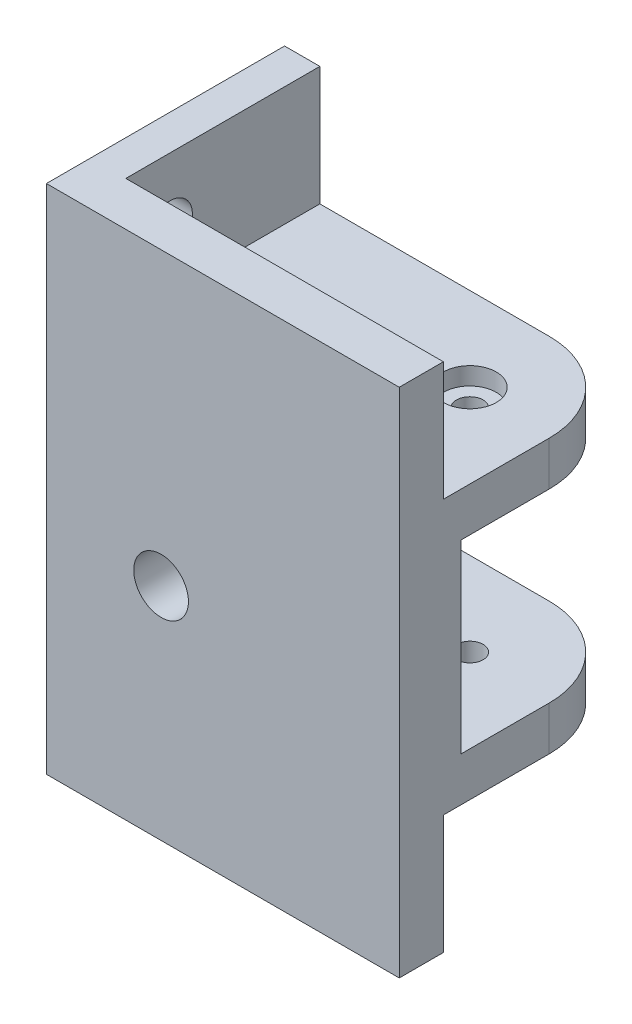
ISO-10303-21;
HEADER;
FILE_DESCRIPTION(('STEP AP214'),'2;1');
FILE_NAME('part.step','',(''),(''),'','','');
FILE_SCHEMA(('AUTOMOTIVE_DESIGN { 1 0 10303 214 1 1 1 1 }'));
ENDSEC;
DATA;
#1=APPLICATION_CONTEXT('core data for automotive mechanical design processes');
#2=APPLICATION_PROTOCOL_DEFINITION('international standard','automotive_design',2000,#1);
#3=PRODUCT_CONTEXT('',#1,'mechanical');
#4=PRODUCT('Part','Part','',(#3));
#5=PRODUCT_RELATED_PRODUCT_CATEGORY('part','',(#4));
#6=PRODUCT_DEFINITION_FORMATION('','',#4);
#7=PRODUCT_DEFINITION_CONTEXT('part definition',#1,'design');
#8=PRODUCT_DEFINITION('design','',#6,#7);
#9=PRODUCT_DEFINITION_SHAPE('','',#8);
#10=(LENGTH_UNIT() NAMED_UNIT(*) SI_UNIT(.MILLI.,.METRE.));
#11=(NAMED_UNIT(*) PLANE_ANGLE_UNIT() SI_UNIT($,.RADIAN.));
#12=(NAMED_UNIT(*) SI_UNIT($,.STERADIAN.) SOLID_ANGLE_UNIT());
#13=UNCERTAINTY_MEASURE_WITH_UNIT(LENGTH_MEASURE(1.E-05),#10,'distance_accuracy_value','');
#14=(GEOMETRIC_REPRESENTATION_CONTEXT(3) GLOBAL_UNCERTAINTY_ASSIGNED_CONTEXT((#13)) GLOBAL_UNIT_ASSIGNED_CONTEXT((#10,
#11,#12)) REPRESENTATION_CONTEXT('',''));
#15=CARTESIAN_POINT('',(0.,0.,0.));
#16=DIRECTION('',(0.,0.,1.));
#17=DIRECTION('',(1.,0.,0.));
#18=AXIS2_PLACEMENT_3D('',#15,#16,#17);
#19=CARTESIAN_POINT('',(10.5,-55.5,-4.));
#20=DIRECTION('',(0.,1.,0.));
#21=DIRECTION('',(0.,0.,1.));
#22=AXIS2_PLACEMENT_3D('',#19,#20,#21);
#23=CYLINDRICAL_SURFACE('',#22,1.51);
#24=CARTESIAN_POINT('',(10.5,18.5,-4.));
#25=DIRECTION('',(0.,1.,0.));
#26=DIRECTION('',(0.,0.,1.));
#27=AXIS2_PLACEMENT_3D('',#24,#25,#26);
#28=CIRCLE('',#27,1.51);
#29=CARTESIAN_POINT('',(10.5,18.5,-2.49));
#30=VERTEX_POINT('',#29);
#31=EDGE_CURVE('E333',#30,#30,#28,.T.);
#32=ORIENTED_EDGE('',*,*,#31,.T.);
#33=EDGE_LOOP('',(#32));
#34=FACE_BOUND('',#33,.T.);
#35=CARTESIAN_POINT('',(10.5,15.5,-4.));
#36=DIRECTION('',(0.,-1.,0.));
#37=DIRECTION('',(0.,0.,-1.));
#38=AXIS2_PLACEMENT_3D('',#35,#36,#37);
#39=CIRCLE('',#38,1.51);
#40=CARTESIAN_POINT('',(10.5,15.5,-5.51));
#41=VERTEX_POINT('',#40);
#42=EDGE_CURVE('E122',#41,#41,#39,.F.);
#43=ORIENTED_EDGE('',*,*,#42,.F.);
#44=EDGE_LOOP('',(#43));
#45=FACE_BOUND('',#44,.T.);
#46=ADVANCED_FACE('F118',(#34,#45),#23,.F.);
#47=CARTESIAN_POINT('',(10.5,39.5,-4.));
#48=DIRECTION('',(0.,1.,0.));
#49=DIRECTION('',(0.,0.,1.));
#50=AXIS2_PLACEMENT_3D('',#47,#48,#49);
#51=CIRCLE('',#50,1.51);
#52=CARTESIAN_POINT('',(10.5,39.5,-2.49));
#53=VERTEX_POINT('',#52);
#54=EDGE_CURVE('E245',#53,#53,#51,.T.);
#55=ORIENTED_EDGE('',*,*,#54,.F.);
#56=EDGE_LOOP('',(#55));
#57=FACE_BOUND('',#56,.T.);
#58=CARTESIAN_POINT('',(10.5,42.5,-4.));
#59=DIRECTION('',(0.,1.,0.));
#60=DIRECTION('',(0.,0.,1.));
#61=AXIS2_PLACEMENT_3D('',#58,#59,#60);
#62=CIRCLE('',#61,1.51);
#63=CARTESIAN_POINT('',(10.5,42.5,-2.49));
#64=VERTEX_POINT('',#63);
#65=EDGE_CURVE('E331',#64,#64,#62,.F.);
#66=ORIENTED_EDGE('',*,*,#65,.F.);
#67=EDGE_LOOP('',(#66));
#68=FACE_BOUND('',#67,.T.);
#69=ADVANCED_FACE('F468',(#57,#68),#23,.F.);
#70=CARTESIAN_POINT('',(0.,0.,8.5));
#71=DIRECTION('',(0.,0.,-1.));
#72=DIRECTION('',(-1.,0.,0.));
#73=AXIS2_PLACEMENT_3D('',#70,#71,#72);
#74=PLANE('',#73);
#75=DIRECTION('',(0.,1.,0.));
#76=VECTOR('',#75,1.);
#77=CARTESIAN_POINT('',(20.,0.,8.5));
#78=LINE('',#77,#76);
#79=CARTESIAN_POINT('',(20.,44.5,8.5));
#80=VERTEX_POINT('',#79);
#81=CARTESIAN_POINT('',(20.,58.,8.5));
#82=VERTEX_POINT('',#81);
#83=EDGE_CURVE('E298',#80,#82,#78,.T.);
#84=ORIENTED_EDGE('',*,*,#83,.F.);
#85=DIRECTION('',(-1.,0.,0.));
#86=VECTOR('',#85,1.);
#87=CARTESIAN_POINT('',(20.,44.5,8.5));
#88=LINE('',#87,#86);
#89=CARTESIAN_POINT('',(-16.,44.5,8.5));
#90=VERTEX_POINT('',#89);
#91=EDGE_CURVE('E390',#80,#90,#88,.T.);
#92=ORIENTED_EDGE('',*,*,#91,.T.);
#93=DIRECTION('',(0.,-1.,0.));
#94=VECTOR('',#93,1.);
#95=CARTESIAN_POINT('',(-16.,58.,8.5));
#96=LINE('',#95,#94);
#97=CARTESIAN_POINT('',(-16.,58.,8.5));
#98=VERTEX_POINT('',#97);
#99=EDGE_CURVE('E282',#98,#90,#96,.T.);
#100=ORIENTED_EDGE('',*,*,#99,.F.);
#101=DIRECTION('',(1.,0.,0.));
#102=VECTOR('',#101,1.);
#103=CARTESIAN_POINT('',(0.,58.,8.5));
#104=LINE('',#103,#102);
#105=EDGE_CURVE('E302',#98,#82,#104,.T.);
#106=ORIENTED_EDGE('',*,*,#105,.T.);
#107=EDGE_LOOP('',(#84,#92,#100,#106));
#108=FACE_BOUND('',#107,.T.);
#109=ADVANCED_FACE('F420',(#108),#74,.T.);
#110=CARTESIAN_POINT('',(-16.,58.,-13.5));
#111=DIRECTION('',(-1.,0.,0.));
#112=DIRECTION('',(0.,0.,1.));
#113=AXIS2_PLACEMENT_3D('',#110,#111,#112);
#114=PLANE('',#113);
#115=CARTESIAN_POINT('',(-16.,50.75,3.5));
#116=DIRECTION('',(-1.,0.,0.));
#117=DIRECTION('',(0.,0.,1.));
#118=AXIS2_PLACEMENT_3D('',#115,#116,#117);
#119=CIRCLE('',#118,2.55);
#120=CARTESIAN_POINT('',(-16.,50.75,6.05));
#121=VERTEX_POINT('',#120);
#122=EDGE_CURVE('E275',#121,#121,#119,.T.);
#123=ORIENTED_EDGE('',*,*,#122,.T.);
#124=EDGE_LOOP('',(#123));
#125=FACE_BOUND('',#124,.T.);
#126=DIRECTION('',(0.,0.,-1.));
#127=VECTOR('',#126,1.);
#128=CARTESIAN_POINT('',(-16.,44.5,8.5));
#129=LINE('',#128,#127);
#130=CARTESIAN_POINT('',(-16.,44.5,-13.5));
#131=VERTEX_POINT('',#130);
#132=EDGE_CURVE('E393',#90,#131,#129,.T.);
#133=ORIENTED_EDGE('',*,*,#132,.T.);
#134=DIRECTION('',(0.,-1.,0.));
#135=VECTOR('',#134,1.);
#136=CARTESIAN_POINT('',(-16.,58.,-13.5));
#137=LINE('',#136,#135);
#138=CARTESIAN_POINT('',(-16.,58.,-13.5));
#139=VERTEX_POINT('',#138);
#140=EDGE_CURVE('E286',#139,#131,#137,.T.);
#141=ORIENTED_EDGE('',*,*,#140,.F.);
#142=DIRECTION('',(0.,0.,1.));
#143=VECTOR('',#142,1.);
#144=CARTESIAN_POINT('',(-16.,58.,-13.5));
#145=LINE('',#144,#143);
#146=EDGE_CURVE('E278',#139,#98,#145,.T.);
#147=ORIENTED_EDGE('',*,*,#146,.T.);
#148=ORIENTED_EDGE('',*,*,#99,.T.);
#149=EDGE_LOOP('',(#133,#141,#147,#148));
#150=FACE_BOUND('',#149,.T.);
#151=ADVANCED_FACE('F415',(#125,#150),#114,.F.);
#152=CARTESIAN_POINT('',(-20.,58.,-13.5));
#153=DIRECTION('',(0.,0.,-1.));
#154=DIRECTION('',(-1.,0.,0.));
#155=AXIS2_PLACEMENT_3D('',#152,#153,#154);
#156=PLANE('',#155);
#157=CARTESIAN_POINT('',(-7.,25.,-13.5));
#158=DIRECTION('',(0.,0.,1.));
#159=DIRECTION('',(1.,0.,0.));
#160=AXIS2_PLACEMENT_3D('',#157,#158,#159);
#161=CIRCLE('',#160,3.1);
#162=CARTESIAN_POINT('',(-3.9,25.,-13.5));
#163=VERTEX_POINT('',#162);
#164=EDGE_CURVE('E359',#163,#163,#161,.T.);
#165=ORIENTED_EDGE('',*,*,#164,.T.);
#166=EDGE_LOOP('',(#165));
#167=FACE_BOUND('',#166,.T.);
#168=DIRECTION('',(0.,-1.,0.));
#169=VECTOR('',#168,1.);
#170=CARTESIAN_POINT('',(10.,18.5,-13.5));
#171=LINE('',#170,#169);
#172=CARTESIAN_POINT('',(10.,18.5,-13.5));
#173=VERTEX_POINT('',#172);
#174=CARTESIAN_POINT('',(10.,13.5,-13.5));
#175=VERTEX_POINT('',#174);
#176=EDGE_CURVE('E378',#173,#175,#171,.T.);
#177=ORIENTED_EDGE('',*,*,#176,.T.);
#178=DIRECTION('',(1.,0.,0.));
#179=VECTOR('',#178,1.);
#180=CARTESIAN_POINT('',(-16.,13.5,-13.5));
#181=LINE('',#180,#179);
#182=CARTESIAN_POINT('',(-16.,13.5,-13.5));
#183=VERTEX_POINT('',#182);
#184=EDGE_CURVE('E362',#183,#175,#181,.T.);
#185=ORIENTED_EDGE('',*,*,#184,.F.);
#186=DIRECTION('',(0.,1.,0.));
#187=VECTOR('',#186,1.);
#188=CARTESIAN_POINT('',(-16.,0.,-13.5));
#189=LINE('',#188,#187);
#190=CARTESIAN_POINT('',(-16.,0.,-13.5));
#191=VERTEX_POINT('',#190);
#192=EDGE_CURVE('E143',#191,#183,#189,.T.);
#193=ORIENTED_EDGE('',*,*,#192,.F.);
#194=DIRECTION('',(1.,0.,0.));
#195=VECTOR('',#194,1.);
#196=CARTESIAN_POINT('',(0.,0.,-13.5));
#197=LINE('',#196,#195);
#198=CARTESIAN_POINT('',(-20.,0.,-13.5));
#199=VERTEX_POINT('',#198);
#200=EDGE_CURVE('E291',#199,#191,#197,.T.);
#201=ORIENTED_EDGE('',*,*,#200,.F.);
#202=DIRECTION('',(0.,-1.,0.));
#203=VECTOR('',#202,1.);
#204=CARTESIAN_POINT('',(-20.,58.,-13.5));
#205=LINE('',#204,#203);
#206=CARTESIAN_POINT('',(-20.,58.,-13.5));
#207=VERTEX_POINT('',#206);
#208=EDGE_CURVE('E12',#207,#199,#205,.T.);
#209=ORIENTED_EDGE('',*,*,#208,.F.);
#210=DIRECTION('',(1.,0.,0.));
#211=VECTOR('',#210,1.);
#212=CARTESIAN_POINT('',(-20.,58.,-13.5));
#213=LINE('',#212,#211);
#214=EDGE_CURVE('E280',#207,#139,#213,.T.);
#215=ORIENTED_EDGE('',*,*,#214,.T.);
#216=ORIENTED_EDGE('',*,*,#140,.T.);
#217=DIRECTION('',(1.,0.,0.));
#218=VECTOR('',#217,1.);
#219=CARTESIAN_POINT('',(-16.,44.5,-13.5));
#220=LINE('',#219,#218);
#221=CARTESIAN_POINT('',(10.,44.5,-13.5));
#222=VERTEX_POINT('',#221);
#223=EDGE_CURVE('E381',#131,#222,#220,.T.);
#224=ORIENTED_EDGE('',*,*,#223,.T.);
#225=DIRECTION('',(0.,1.,0.));
#226=VECTOR('',#225,1.);
#227=CARTESIAN_POINT('',(10.,39.5,-13.5));
#228=LINE('',#227,#226);
#229=CARTESIAN_POINT('',(10.,39.5,-13.5));
#230=VERTEX_POINT('',#229);
#231=EDGE_CURVE('E399',#230,#222,#228,.T.);
#232=ORIENTED_EDGE('',*,*,#231,.F.);
#233=DIRECTION('',(1.,0.,0.));
#234=VECTOR('',#233,1.);
#235=CARTESIAN_POINT('',(-3.84067777581261E-13,39.5,-13.4999999999999));
#236=LINE('',#235,#234);
#237=CARTESIAN_POINT('',(0.,39.5,-13.5));
#238=VERTEX_POINT('',#237);
#239=EDGE_CURVE('E260',#238,#230,#236,.T.);
#240=ORIENTED_EDGE('',*,*,#239,.F.);
#241=DIRECTION('',(0.,1.,0.));
#242=VECTOR('',#241,1.);
#243=CARTESIAN_POINT('',(0.,13.5,-13.5));
#244=LINE('',#243,#242);
#245=CARTESIAN_POINT('',(0.,18.5,-13.5));
#246=VERTEX_POINT('',#245);
#247=EDGE_CURVE('E253',#246,#238,#244,.T.);
#248=ORIENTED_EDGE('',*,*,#247,.F.);
#249=DIRECTION('',(1.,0.,0.));
#250=VECTOR('',#249,1.);
#251=CARTESIAN_POINT('',(0.,18.5,-13.5));
#252=LINE('',#251,#250);
#253=EDGE_CURVE('E261',#246,#173,#252,.T.);
#254=ORIENTED_EDGE('',*,*,#253,.T.);
#255=EDGE_LOOP('',(#177,#185,#193,#201,#209,#215,#216,#224,#232,#240,#248,#254));
#256=FACE_BOUND('',#255,.T.);
#257=ADVANCED_FACE('F120',(#167,#256),#156,.T.);
#258=CARTESIAN_POINT('',(20.,58.,1.5));
#259=DIRECTION('',(1.,0.,0.));
#260=DIRECTION('',(0.,0.,-1.));
#261=AXIS2_PLACEMENT_3D('',#258,#259,#260);
#262=PLANE('',#261);
#263=DIRECTION('',(0.,0.,1.));
#264=VECTOR('',#263,1.);
#265=CARTESIAN_POINT('',(20.,13.5,-3.5));
#266=LINE('',#265,#264);
#267=CARTESIAN_POINT('',(20.,13.5,-3.5));
#268=VERTEX_POINT('',#267);
#269=CARTESIAN_POINT('',(20.,13.5,8.5));
#270=VERTEX_POINT('',#269);
#271=EDGE_CURVE('E370',#268,#270,#266,.T.);
#272=ORIENTED_EDGE('',*,*,#271,.F.);
#273=DIRECTION('',(0.,-1.,0.));
#274=VECTOR('',#273,1.);
#275=CARTESIAN_POINT('',(20.,18.5,-3.5));
#276=LINE('',#275,#274);
#277=CARTESIAN_POINT('',(20.,18.5,-3.5));
#278=VERTEX_POINT('',#277);
#279=EDGE_CURVE('E258',#278,#268,#276,.T.);
#280=ORIENTED_EDGE('',*,*,#279,.F.);
#281=DIRECTION('',(0.,0.,-1.));
#282=VECTOR('',#281,1.);
#283=CARTESIAN_POINT('',(20.,18.5,6.5));
#284=LINE('',#283,#282);
#285=CARTESIAN_POINT('',(20.,18.5,6.5));
#286=VERTEX_POINT('',#285);
#287=EDGE_CURVE('E239',#286,#278,#284,.T.);
#288=ORIENTED_EDGE('',*,*,#287,.F.);
#289=DIRECTION('',(0.,1.,0.));
#290=VECTOR('',#289,1.);
#291=CARTESIAN_POINT('',(20.,13.5,6.5));
#292=LINE('',#291,#290);
#293=CARTESIAN_POINT('',(20.,39.5,6.5));
#294=VERTEX_POINT('',#293);
#295=EDGE_CURVE('E248',#286,#294,#292,.T.);
#296=ORIENTED_EDGE('',*,*,#295,.T.);
#297=DIRECTION('',(0.,0.,1.));
#298=VECTOR('',#297,1.);
#299=CARTESIAN_POINT('',(20.,39.5,0.));
#300=LINE('',#299,#298);
#301=CARTESIAN_POINT('',(20.,39.5,-3.5));
#302=VERTEX_POINT('',#301);
#303=EDGE_CURVE('E254',#302,#294,#300,.T.);
#304=ORIENTED_EDGE('',*,*,#303,.F.);
#305=DIRECTION('',(0.,1.,0.));
#306=VECTOR('',#305,1.);
#307=CARTESIAN_POINT('',(20.,39.5,-3.5));
#308=LINE('',#307,#306);
#309=CARTESIAN_POINT('',(20.,44.5,-3.5));
#310=VERTEX_POINT('',#309);
#311=EDGE_CURVE('E264',#302,#310,#308,.T.);
#312=ORIENTED_EDGE('',*,*,#311,.T.);
#313=DIRECTION('',(0.,0.,1.));
#314=VECTOR('',#313,1.);
#315=CARTESIAN_POINT('',(20.,44.5,-3.5));
#316=LINE('',#315,#314);
#317=EDGE_CURVE('E387',#310,#80,#316,.T.);
#318=ORIENTED_EDGE('',*,*,#317,.T.);
#319=ORIENTED_EDGE('',*,*,#83,.T.);
#320=DIRECTION('',(0.,0.,1.));
#321=VECTOR('',#320,1.);
#322=CARTESIAN_POINT('',(20.,58.,1.5));
#323=LINE('',#322,#321);
#324=CARTESIAN_POINT('',(20.,58.,13.5));
#325=VERTEX_POINT('',#324);
#326=EDGE_CURVE('E316',#82,#325,#323,.T.);
#327=ORIENTED_EDGE('',*,*,#326,.T.);
#328=DIRECTION('',(0.,-1.,0.));
#329=VECTOR('',#328,1.);
#330=CARTESIAN_POINT('',(20.,58.,13.5));
#331=LINE('',#330,#329);
#332=CARTESIAN_POINT('',(20.,0.,13.5));
#333=VERTEX_POINT('',#332);
#334=EDGE_CURVE('E318',#325,#333,#331,.T.);
#335=ORIENTED_EDGE('',*,*,#334,.T.);
#336=DIRECTION('',(0.,0.,1.));
#337=VECTOR('',#336,1.);
#338=CARTESIAN_POINT('',(20.,0.,1.5));
#339=LINE('',#338,#337);
#340=CARTESIAN_POINT('',(20.,0.,8.5));
#341=VERTEX_POINT('',#340);
#342=EDGE_CURVE('E313',#341,#333,#339,.T.);
#343=ORIENTED_EDGE('',*,*,#342,.F.);
#344=DIRECTION('',(0.,-1.,0.));
#345=VECTOR('',#344,1.);
#346=CARTESIAN_POINT('',(20.,0.,8.5));
#347=LINE('',#346,#345);
#348=EDGE_CURVE('E299',#270,#341,#347,.T.);
#349=ORIENTED_EDGE('',*,*,#348,.F.);
#350=EDGE_LOOP('',(#272,#280,#288,#296,#304,#312,#318,#319,#327,#335,#343,#349));
#351=FACE_BOUND('',#350,.T.);
#352=ADVANCED_FACE('F257',(#351),#262,.T.);
#353=CARTESIAN_POINT('',(-20.,58.,13.5));
#354=DIRECTION('',(-1.,0.,0.));
#355=DIRECTION('',(0.,0.,1.));
#356=AXIS2_PLACEMENT_3D('',#353,#354,#355);
#357=PLANE('',#356);
#358=CARTESIAN_POINT('',(-20.,50.75,3.5));
#359=DIRECTION('',(-1.,0.,0.));
#360=DIRECTION('',(0.,0.,1.));
#361=AXIS2_PLACEMENT_3D('',#358,#359,#360);
#362=CIRCLE('',#361,2.55);
#363=CARTESIAN_POINT('',(-20.,50.75,6.05));
#364=VERTEX_POINT('',#363);
#365=EDGE_CURVE('E272',#364,#364,#362,.T.);
#366=ORIENTED_EDGE('',*,*,#365,.F.);
#367=EDGE_LOOP('',(#366));
#368=FACE_BOUND('',#367,.T.);
#369=CARTESIAN_POINT('',(-20.,7.25000000000003,3.5));
#370=DIRECTION('',(-1.,0.,0.));
#371=DIRECTION('',(0.,0.,1.));
#372=AXIS2_PLACEMENT_3D('',#369,#370,#371);
#373=CIRCLE('',#372,2.55);
#374=CARTESIAN_POINT('',(-20.,7.25000000000003,6.05));
#375=VERTEX_POINT('',#374);
#376=EDGE_CURVE('E270',#375,#375,#373,.T.);
#377=ORIENTED_EDGE('',*,*,#376,.F.);
#378=EDGE_LOOP('',(#377));
#379=FACE_BOUND('',#378,.T.);
#380=DIRECTION('',(0.,0.,-1.));
#381=VECTOR('',#380,1.);
#382=CARTESIAN_POINT('',(-20.,58.,13.5));
#383=LINE('',#382,#381);
#384=CARTESIAN_POINT('',(-20.,58.,13.5));
#385=VERTEX_POINT('',#384);
#386=EDGE_CURVE('E309',#385,#207,#383,.T.);
#387=ORIENTED_EDGE('',*,*,#386,.T.);
#388=ORIENTED_EDGE('',*,*,#208,.T.);
#389=DIRECTION('',(0.,0.,-1.));
#390=VECTOR('',#389,1.);
#391=CARTESIAN_POINT('',(-20.,0.,13.5));
#392=LINE('',#391,#390);
#393=CARTESIAN_POINT('',(-20.,0.,13.5));
#394=VERTEX_POINT('',#393);
#395=EDGE_CURVE('E305',#394,#199,#392,.T.);
#396=ORIENTED_EDGE('',*,*,#395,.F.);
#397=DIRECTION('',(0.,-1.,0.));
#398=VECTOR('',#397,1.);
#399=CARTESIAN_POINT('',(-20.,58.,13.5));
#400=LINE('',#399,#398);
#401=EDGE_CURVE('E127',#385,#394,#400,.T.);
#402=ORIENTED_EDGE('',*,*,#401,.F.);
#403=EDGE_LOOP('',(#387,#388,#396,#402));
#404=FACE_BOUND('',#403,.T.);
#405=ADVANCED_FACE('F437',(#368,#379,#404),#357,.T.);
#406=CARTESIAN_POINT('',(5.,58.,1.5));
#407=DIRECTION('',(0.,1.,0.));
#408=DIRECTION('',(0.,0.,1.));
#409=AXIS2_PLACEMENT_3D('',#406,#407,#408);
#410=PLANE('',#409);
#411=ORIENTED_EDGE('',*,*,#326,.F.);
#412=ORIENTED_EDGE('',*,*,#105,.F.);
#413=ORIENTED_EDGE('',*,*,#146,.F.);
#414=ORIENTED_EDGE('',*,*,#214,.F.);
#415=ORIENTED_EDGE('',*,*,#386,.F.);
#416=DIRECTION('',(1.,0.,0.));
#417=VECTOR('',#416,1.);
#418=CARTESIAN_POINT('',(-20.,58.,13.5));
#419=LINE('',#418,#417);
#420=EDGE_CURVE('E312',#385,#325,#419,.T.);
#421=ORIENTED_EDGE('',*,*,#420,.T.);
#422=EDGE_LOOP('',(#411,#412,#413,#414,#415,#421));
#423=FACE_BOUND('',#422,.T.);
#424=ADVANCED_FACE('F423',(#423),#410,.T.);
#425=CARTESIAN_POINT('',(5.,0.,1.5));
#426=DIRECTION('',(0.,1.,0.));
#427=DIRECTION('',(0.,0.,1.));
#428=AXIS2_PLACEMENT_3D('',#425,#426,#427);
#429=PLANE('',#428);
#430=ORIENTED_EDGE('',*,*,#395,.T.);
#431=ORIENTED_EDGE('',*,*,#200,.T.);
#432=DIRECTION('',(0.,0.,1.));
#433=VECTOR('',#432,1.);
#434=CARTESIAN_POINT('',(-16.,0.,-13.5));
#435=LINE('',#434,#433);
#436=CARTESIAN_POINT('',(-16.,0.,8.5));
#437=VERTEX_POINT('',#436);
#438=EDGE_CURVE('E294',#191,#437,#435,.T.);
#439=ORIENTED_EDGE('',*,*,#438,.T.);
#440=DIRECTION('',(1.,0.,0.));
#441=VECTOR('',#440,1.);
#442=CARTESIAN_POINT('',(0.,0.,8.5));
#443=LINE('',#442,#441);
#444=EDGE_CURVE('E301',#437,#341,#443,.T.);
#445=ORIENTED_EDGE('',*,*,#444,.T.);
#446=ORIENTED_EDGE('',*,*,#342,.T.);
#447=DIRECTION('',(1.,0.,0.));
#448=VECTOR('',#447,1.);
#449=CARTESIAN_POINT('',(-20.,0.,13.5));
#450=LINE('',#449,#448);
#451=EDGE_CURVE('E321',#394,#333,#450,.T.);
#452=ORIENTED_EDGE('',*,*,#451,.F.);
#453=EDGE_LOOP('',(#430,#431,#439,#445,#446,#452));
#454=FACE_BOUND('',#453,.T.);
#455=ADVANCED_FACE('F434',(#454),#429,.F.);
#456=CARTESIAN_POINT('',(-20.,58.,13.5));
#457=DIRECTION('',(0.,0.,-1.));
#458=DIRECTION('',(-1.,0.,0.));
#459=AXIS2_PLACEMENT_3D('',#456,#457,#458);
#460=PLANE('',#459);
#461=CARTESIAN_POINT('',(-7.,25.,13.5));
#462=DIRECTION('',(0.,0.,1.));
#463=DIRECTION('',(1.,0.,0.));
#464=AXIS2_PLACEMENT_3D('',#461,#462,#463);
#465=CIRCLE('',#464,3.1);
#466=CARTESIAN_POINT('',(-3.9,25.,13.5));
#467=VERTEX_POINT('',#466);
#468=EDGE_CURVE('E358',#467,#467,#465,.T.);
#469=ORIENTED_EDGE('',*,*,#468,.F.);
#470=EDGE_LOOP('',(#469));
#471=FACE_BOUND('',#470,.T.);
#472=ORIENTED_EDGE('',*,*,#451,.T.);
#473=ORIENTED_EDGE('',*,*,#334,.F.);
#474=ORIENTED_EDGE('',*,*,#420,.F.);
#475=ORIENTED_EDGE('',*,*,#401,.T.);
#476=EDGE_LOOP('',(#472,#473,#474,#475));
#477=FACE_BOUND('',#476,.T.);
#478=ADVANCED_FACE('F431',(#471,#477),#460,.F.);
#479=CARTESIAN_POINT('',(0.,0.,8.5));
#480=DIRECTION('',(0.,0.,-1.));
#481=DIRECTION('',(-1.,0.,0.));
#482=AXIS2_PLACEMENT_3D('',#479,#480,#481);
#483=PLANE('',#482);
#484=DIRECTION('',(-1.,0.,0.));
#485=VECTOR('',#484,1.);
#486=CARTESIAN_POINT('',(20.,13.5,8.5));
#487=LINE('',#486,#485);
#488=CARTESIAN_POINT('',(-16.,13.5,8.5));
#489=VERTEX_POINT('',#488);
#490=EDGE_CURVE('E135',#270,#489,#487,.T.);
#491=ORIENTED_EDGE('',*,*,#490,.F.);
#492=ORIENTED_EDGE('',*,*,#348,.T.);
#493=ORIENTED_EDGE('',*,*,#444,.F.);
#494=DIRECTION('',(0.,1.,0.));
#495=VECTOR('',#494,1.);
#496=CARTESIAN_POINT('',(-16.,0.,8.5));
#497=LINE('',#496,#495);
#498=EDGE_CURVE('E285',#437,#489,#497,.T.);
#499=ORIENTED_EDGE('',*,*,#498,.T.);
#500=EDGE_LOOP('',(#491,#492,#493,#499));
#501=FACE_BOUND('',#500,.T.);
#502=ADVANCED_FACE('F442',(#501),#483,.T.);
#503=CARTESIAN_POINT('',(-16.,0.,-13.5));
#504=DIRECTION('',(1.,0.,0.));
#505=DIRECTION('',(0.,0.,-1.));
#506=AXIS2_PLACEMENT_3D('',#503,#504,#505);
#507=PLANE('',#506);
#508=DIRECTION('',(0.,0.,-1.));
#509=VECTOR('',#508,1.);
#510=CARTESIAN_POINT('',(-16.,13.5,8.5));
#511=LINE('',#510,#509);
#512=EDGE_CURVE('E374',#489,#183,#511,.T.);
#513=ORIENTED_EDGE('',*,*,#512,.F.);
#514=ORIENTED_EDGE('',*,*,#498,.F.);
#515=ORIENTED_EDGE('',*,*,#438,.F.);
#516=ORIENTED_EDGE('',*,*,#192,.T.);
#517=EDGE_LOOP('',(#513,#514,#515,#516));
#518=FACE_BOUND('',#517,.T.);
#519=CARTESIAN_POINT('',(-16.,7.25000000000003,3.5));
#520=DIRECTION('',(1.,0.,0.));
#521=DIRECTION('',(0.,0.,-1.));
#522=AXIS2_PLACEMENT_3D('',#519,#520,#521);
#523=CIRCLE('',#522,2.55);
#524=CARTESIAN_POINT('',(-16.,7.25000000000003,0.95));
#525=VERTEX_POINT('',#524);
#526=EDGE_CURVE('E281',#525,#525,#523,.T.);
#527=ORIENTED_EDGE('',*,*,#526,.F.);
#528=EDGE_LOOP('',(#527));
#529=FACE_BOUND('',#528,.T.);
#530=ADVANCED_FACE('F440',(#518,#529),#507,.T.);
#531=CARTESIAN_POINT('',(2.,50.75,3.5));
#532=DIRECTION('',(-1.,0.,0.));
#533=DIRECTION('',(0.,0.,1.));
#534=AXIS2_PLACEMENT_3D('',#531,#532,#533);
#535=CYLINDRICAL_SURFACE('',#534,2.55);
#536=ORIENTED_EDGE('',*,*,#365,.T.);
#537=EDGE_LOOP('',(#536));
#538=FACE_BOUND('',#537,.T.);
#539=ORIENTED_EDGE('',*,*,#122,.F.);
#540=EDGE_LOOP('',(#539));
#541=FACE_BOUND('',#540,.T.);
#542=ADVANCED_FACE('F463',(#538,#541),#535,.F.);
#543=CARTESIAN_POINT('',(2.,7.25000000000003,3.5));
#544=DIRECTION('',(-1.,0.,0.));
#545=DIRECTION('',(0.,0.,1.));
#546=AXIS2_PLACEMENT_3D('',#543,#544,#545);
#547=CYLINDRICAL_SURFACE('',#546,2.55);
#548=ORIENTED_EDGE('',*,*,#526,.T.);
#549=EDGE_LOOP('',(#548));
#550=FACE_BOUND('',#549,.T.);
#551=ORIENTED_EDGE('',*,*,#376,.T.);
#552=EDGE_LOOP('',(#551));
#553=FACE_BOUND('',#552,.T.);
#554=ADVANCED_FACE('F454',(#550,#553),#547,.F.);
#555=CARTESIAN_POINT('',(0.,39.5,0.));
#556=DIRECTION('',(0.,1.,0.));
#557=DIRECTION('',(0.,0.,1.));
#558=AXIS2_PLACEMENT_3D('',#555,#556,#557);
#559=PLANE('',#558);
#560=ORIENTED_EDGE('',*,*,#54,.T.);
#561=EDGE_LOOP('',(#560));
#562=FACE_BOUND('',#561,.T.);
#563=ORIENTED_EDGE('',*,*,#239,.T.);
#564=CARTESIAN_POINT('',(10.,39.5,-3.5));
#565=DIRECTION('',(0.,-1.,0.));
#566=DIRECTION('',(0.,0.,-1.));
#567=AXIS2_PLACEMENT_3D('',#564,#565,#566);
#568=CIRCLE('',#567,10.);
#569=EDGE_CURVE('E396',#230,#302,#568,.T.);
#570=ORIENTED_EDGE('',*,*,#569,.T.);
#571=ORIENTED_EDGE('',*,*,#303,.T.);
#572=DIRECTION('',(1.,0.,0.));
#573=VECTOR('',#572,1.);
#574=CARTESIAN_POINT('',(0.,39.5,6.5));
#575=LINE('',#574,#573);
#576=CARTESIAN_POINT('',(0.,39.5,6.5));
#577=VERTEX_POINT('',#576);
#578=EDGE_CURVE('E244',#577,#294,#575,.T.);
#579=ORIENTED_EDGE('',*,*,#578,.F.);
#580=DIRECTION('',(0.,0.,-1.));
#581=VECTOR('',#580,1.);
#582=CARTESIAN_POINT('',(0.,39.5,6.5));
#583=LINE('',#582,#581);
#584=EDGE_CURVE('E356',#577,#238,#583,.T.);
#585=ORIENTED_EDGE('',*,*,#584,.T.);
#586=EDGE_LOOP('',(#563,#570,#571,#579,#585));
#587=FACE_BOUND('',#586,.T.);
#588=ADVANCED_FACE('F452',(#562,#587),#559,.F.);
#589=CARTESIAN_POINT('',(5.,18.5,1.5));
#590=DIRECTION('',(0.,1.,0.));
#591=DIRECTION('',(0.,0.,1.));
#592=AXIS2_PLACEMENT_3D('',#589,#590,#591);
#593=PLANE('',#592);
#594=ORIENTED_EDGE('',*,*,#31,.F.);
#595=EDGE_LOOP('',(#594));
#596=FACE_BOUND('',#595,.T.);
#597=ORIENTED_EDGE('',*,*,#253,.F.);
#598=DIRECTION('',(0.,0.,-1.));
#599=VECTOR('',#598,1.);
#600=CARTESIAN_POINT('',(0.,18.5,6.5));
#601=LINE('',#600,#599);
#602=CARTESIAN_POINT('',(0.,18.5,6.5));
#603=VERTEX_POINT('',#602);
#604=EDGE_CURVE('E241',#603,#246,#601,.T.);
#605=ORIENTED_EDGE('',*,*,#604,.F.);
#606=DIRECTION('',(1.,0.,0.));
#607=VECTOR('',#606,1.);
#608=CARTESIAN_POINT('',(0.,18.5,6.5));
#609=LINE('',#608,#607);
#610=EDGE_CURVE('E233',#603,#286,#609,.T.);
#611=ORIENTED_EDGE('',*,*,#610,.T.);
#612=ORIENTED_EDGE('',*,*,#287,.T.);
#613=CARTESIAN_POINT('',(10.,18.5,-3.5));
#614=DIRECTION('',(0.,-1.,0.));
#615=DIRECTION('',(0.,0.,-1.));
#616=AXIS2_PLACEMENT_3D('',#613,#614,#615);
#617=CIRCLE('',#616,10.);
#618=EDGE_CURVE('E376',#173,#278,#617,.T.);
#619=ORIENTED_EDGE('',*,*,#618,.F.);
#620=EDGE_LOOP('',(#597,#605,#611,#612,#619));
#621=FACE_BOUND('',#620,.T.);
#622=ADVANCED_FACE('F236',(#596,#621),#593,.T.);
#623=CARTESIAN_POINT('',(10.,39.5,-3.5));
#624=DIRECTION('',(0.,1.,0.));
#625=DIRECTION('',(0.,0.,1.));
#626=AXIS2_PLACEMENT_3D('',#623,#624,#625);
#627=CYLINDRICAL_SURFACE('',#626,10.);
#628=ORIENTED_EDGE('',*,*,#231,.T.);
#629=CARTESIAN_POINT('',(10.,44.5,-3.5));
#630=DIRECTION('',(0.,-1.,0.));
#631=DIRECTION('',(0.,0.,-1.));
#632=AXIS2_PLACEMENT_3D('',#629,#630,#631);
#633=CIRCLE('',#632,10.);
#634=EDGE_CURVE('E384',#222,#310,#633,.T.);
#635=ORIENTED_EDGE('',*,*,#634,.T.);
#636=ORIENTED_EDGE('',*,*,#311,.F.);
#637=ORIENTED_EDGE('',*,*,#569,.F.);
#638=EDGE_LOOP('',(#628,#635,#636,#637));
#639=FACE_BOUND('',#638,.T.);
#640=ADVANCED_FACE('F408',(#639),#627,.T.);
#641=CARTESIAN_POINT('',(10.,44.5,-3.5));
#642=DIRECTION('',(0.,-1.,0.));
#643=DIRECTION('',(0.,0.,-1.));
#644=AXIS2_PLACEMENT_3D('',#641,#642,#643);
#645=PLANE('',#644);
#646=CARTESIAN_POINT('',(10.5,44.5,-4.));
#647=DIRECTION('',(0.,1.,0.));
#648=DIRECTION('',(0.,0.,1.));
#649=AXIS2_PLACEMENT_3D('',#646,#647,#648);
#650=CIRCLE('',#649,3.);
#651=CARTESIAN_POINT('',(10.5,44.5,-1.));
#652=VERTEX_POINT('',#651);
#653=EDGE_CURVE('E340',#652,#652,#650,.T.);
#654=ORIENTED_EDGE('',*,*,#653,.F.);
#655=EDGE_LOOP('',(#654));
#656=FACE_BOUND('',#655,.T.);
#657=ORIENTED_EDGE('',*,*,#223,.F.);
#658=ORIENTED_EDGE('',*,*,#132,.F.);
#659=ORIENTED_EDGE('',*,*,#91,.F.);
#660=ORIENTED_EDGE('',*,*,#317,.F.);
#661=ORIENTED_EDGE('',*,*,#634,.F.);
#662=EDGE_LOOP('',(#657,#658,#659,#660,#661));
#663=FACE_BOUND('',#662,.T.);
#664=ADVANCED_FACE('F407',(#656,#663),#645,.F.);
#665=CARTESIAN_POINT('',(10.,18.5,-3.5));
#666=DIRECTION('',(0.,-1.,0.));
#667=DIRECTION('',(0.,0.,-1.));
#668=AXIS2_PLACEMENT_3D('',#665,#666,#667);
#669=CYLINDRICAL_SURFACE('',#668,10.);
#670=ORIENTED_EDGE('',*,*,#279,.T.);
#671=CARTESIAN_POINT('',(10.,13.5,-3.5));
#672=DIRECTION('',(0.,-1.,0.));
#673=DIRECTION('',(0.,0.,-1.));
#674=AXIS2_PLACEMENT_3D('',#671,#672,#673);
#675=CIRCLE('',#674,10.);
#676=EDGE_CURVE('E367',#175,#268,#675,.T.);
#677=ORIENTED_EDGE('',*,*,#676,.F.);
#678=ORIENTED_EDGE('',*,*,#176,.F.);
#679=ORIENTED_EDGE('',*,*,#618,.T.);
#680=EDGE_LOOP('',(#670,#677,#678,#679));
#681=FACE_BOUND('',#680,.T.);
#682=ADVANCED_FACE('F448',(#681),#669,.T.);
#683=CARTESIAN_POINT('',(10.,13.5,-3.5));
#684=DIRECTION('',(0.,-1.,0.));
#685=DIRECTION('',(0.,0.,-1.));
#686=AXIS2_PLACEMENT_3D('',#683,#684,#685);
#687=PLANE('',#686);
#688=CARTESIAN_POINT('',(10.5,13.5,-4.));
#689=DIRECTION('',(0.,-1.,0.));
#690=DIRECTION('',(0.,0.,-1.));
#691=AXIS2_PLACEMENT_3D('',#688,#689,#690);
#692=CIRCLE('',#691,3.);
#693=CARTESIAN_POINT('',(10.5,13.5,-7.));
#694=VERTEX_POINT('',#693);
#695=EDGE_CURVE('E347',#694,#694,#692,.T.);
#696=ORIENTED_EDGE('',*,*,#695,.F.);
#697=EDGE_LOOP('',(#696));
#698=FACE_BOUND('',#697,.T.);
#699=ORIENTED_EDGE('',*,*,#184,.T.);
#700=ORIENTED_EDGE('',*,*,#676,.T.);
#701=ORIENTED_EDGE('',*,*,#271,.T.);
#702=ORIENTED_EDGE('',*,*,#490,.T.);
#703=ORIENTED_EDGE('',*,*,#512,.T.);
#704=EDGE_LOOP('',(#699,#700,#701,#702,#703));
#705=FACE_BOUND('',#704,.T.);
#706=ADVANCED_FACE('F444',(#698,#705),#687,.T.);
#707=CARTESIAN_POINT('',(-7.,25.,-13.5));
#708=DIRECTION('',(0.,0.,1.));
#709=DIRECTION('',(1.,0.,0.));
#710=AXIS2_PLACEMENT_3D('',#707,#708,#709);
#711=CYLINDRICAL_SURFACE('',#710,3.1);
#712=ORIENTED_EDGE('',*,*,#164,.F.);
#713=EDGE_LOOP('',(#712));
#714=FACE_BOUND('',#713,.T.);
#715=ORIENTED_EDGE('',*,*,#468,.T.);
#716=EDGE_LOOP('',(#715));
#717=FACE_BOUND('',#716,.T.);
#718=ADVANCED_FACE('F485',(#714,#717),#711,.F.);
#719=CARTESIAN_POINT('',(0.,39.5,6.5));
#720=DIRECTION('',(1.,0.,0.));
#721=DIRECTION('',(0.,0.,-1.));
#722=AXIS2_PLACEMENT_3D('',#719,#720,#721);
#723=PLANE('',#722);
#724=ORIENTED_EDGE('',*,*,#247,.T.);
#725=ORIENTED_EDGE('',*,*,#584,.F.);
#726=DIRECTION('',(0.,-1.,0.));
#727=VECTOR('',#726,1.);
#728=CARTESIAN_POINT('',(0.,39.5,6.5));
#729=LINE('',#728,#727);
#730=EDGE_CURVE('E353',#577,#603,#729,.T.);
#731=ORIENTED_EDGE('',*,*,#730,.T.);
#732=ORIENTED_EDGE('',*,*,#604,.T.);
#733=EDGE_LOOP('',(#724,#725,#731,#732));
#734=FACE_BOUND('',#733,.T.);
#735=ADVANCED_FACE('F450',(#734),#723,.T.);
#736=CARTESIAN_POINT('',(0.,0.,6.5));
#737=DIRECTION('',(0.,0.,-1.));
#738=DIRECTION('',(-1.,0.,0.));
#739=AXIS2_PLACEMENT_3D('',#736,#737,#738);
#740=PLANE('',#739);
#741=ORIENTED_EDGE('',*,*,#610,.F.);
#742=ORIENTED_EDGE('',*,*,#730,.F.);
#743=ORIENTED_EDGE('',*,*,#578,.T.);
#744=ORIENTED_EDGE('',*,*,#295,.F.);
#745=EDGE_LOOP('',(#741,#742,#743,#744));
#746=FACE_BOUND('',#745,.T.);
#747=ADVANCED_FACE('F249',(#746),#740,.T.);
#748=CARTESIAN_POINT('',(10.5,42.5,-4.));
#749=DIRECTION('',(0.,1.,0.));
#750=DIRECTION('',(0.,0.,1.));
#751=AXIS2_PLACEMENT_3D('',#748,#749,#750);
#752=PLANE('',#751);
#753=CARTESIAN_POINT('',(10.5,42.5,-4.));
#754=DIRECTION('',(0.,1.,0.));
#755=DIRECTION('',(0.,0.,1.));
#756=AXIS2_PLACEMENT_3D('',#753,#754,#755);
#757=CIRCLE('',#756,3.);
#758=CARTESIAN_POINT('',(10.5,42.5,-1.));
#759=VERTEX_POINT('',#758);
#760=EDGE_CURVE('E334',#759,#759,#757,.T.);
#761=ORIENTED_EDGE('',*,*,#760,.T.);
#762=EDGE_LOOP('',(#761));
#763=FACE_BOUND('',#762,.T.);
#764=ORIENTED_EDGE('',*,*,#65,.T.);
#765=EDGE_LOOP('',(#764));
#766=FACE_BOUND('',#765,.T.);
#767=ADVANCED_FACE('F482',(#763,#766),#752,.T.);
#768=CARTESIAN_POINT('',(10.5,42.5,-4.));
#769=DIRECTION('',(0.,1.,0.));
#770=DIRECTION('',(0.,0.,1.));
#771=AXIS2_PLACEMENT_3D('',#768,#769,#770);
#772=CYLINDRICAL_SURFACE('',#771,3.);
#773=ORIENTED_EDGE('',*,*,#760,.F.);
#774=EDGE_LOOP('',(#773));
#775=FACE_BOUND('',#774,.T.);
#776=ORIENTED_EDGE('',*,*,#653,.T.);
#777=EDGE_LOOP('',(#776));
#778=FACE_BOUND('',#777,.T.);
#779=ADVANCED_FACE('F478',(#775,#778),#772,.F.);
#780=CARTESIAN_POINT('',(10.5,15.5,-4.));
#781=DIRECTION('',(0.,-1.,0.));
#782=DIRECTION('',(0.,0.,-1.));
#783=AXIS2_PLACEMENT_3D('',#780,#781,#782);
#784=PLANE('',#783);
#785=CARTESIAN_POINT('',(10.5,15.5,-4.));
#786=DIRECTION('',(0.,-1.,0.));
#787=DIRECTION('',(0.,0.,-1.));
#788=AXIS2_PLACEMENT_3D('',#785,#786,#787);
#789=CIRCLE('',#788,3.);
#790=CARTESIAN_POINT('',(10.5,15.5,-7.));
#791=VERTEX_POINT('',#790);
#792=EDGE_CURVE('E808',#791,#791,#789,.T.);
#793=ORIENTED_EDGE('',*,*,#792,.T.);
#794=EDGE_LOOP('',(#793));
#795=FACE_BOUND('',#794,.T.);
#796=ORIENTED_EDGE('',*,*,#42,.T.);
#797=EDGE_LOOP('',(#796));
#798=FACE_BOUND('',#797,.T.);
#799=ADVANCED_FACE('F545',(#795,#798),#784,.T.);
#800=CARTESIAN_POINT('',(10.5,15.5,-4.));
#801=DIRECTION('',(0.,-1.,0.));
#802=DIRECTION('',(0.,0.,-1.));
#803=AXIS2_PLACEMENT_3D('',#800,#801,#802);
#804=CYLINDRICAL_SURFACE('',#803,3.);
#805=ORIENTED_EDGE('',*,*,#792,.F.);
#806=EDGE_LOOP('',(#805));
#807=FACE_BOUND('',#806,.T.);
#808=ORIENTED_EDGE('',*,*,#695,.T.);
#809=EDGE_LOOP('',(#808));
#810=FACE_BOUND('',#809,.T.);
#811=ADVANCED_FACE('F551',(#807,#810),#804,.F.);
#812=CLOSED_SHELL('',(#46,#69,#109,#151,#257,#352,#405,#424,#455,#478,#502,#530,#542,#554,#588,
#622,#640,#664,#682,#706,#718,#735,#747,#767,#779,#799,#811));
#813=MANIFOLD_SOLID_BREP('B2',#812);
#814=ADVANCED_BREP_SHAPE_REPRESENTATION('',(#18,#813),#14);
#815=SHAPE_DEFINITION_REPRESENTATION(#9,#814);
ENDSEC;
END-ISO-10303-21;
